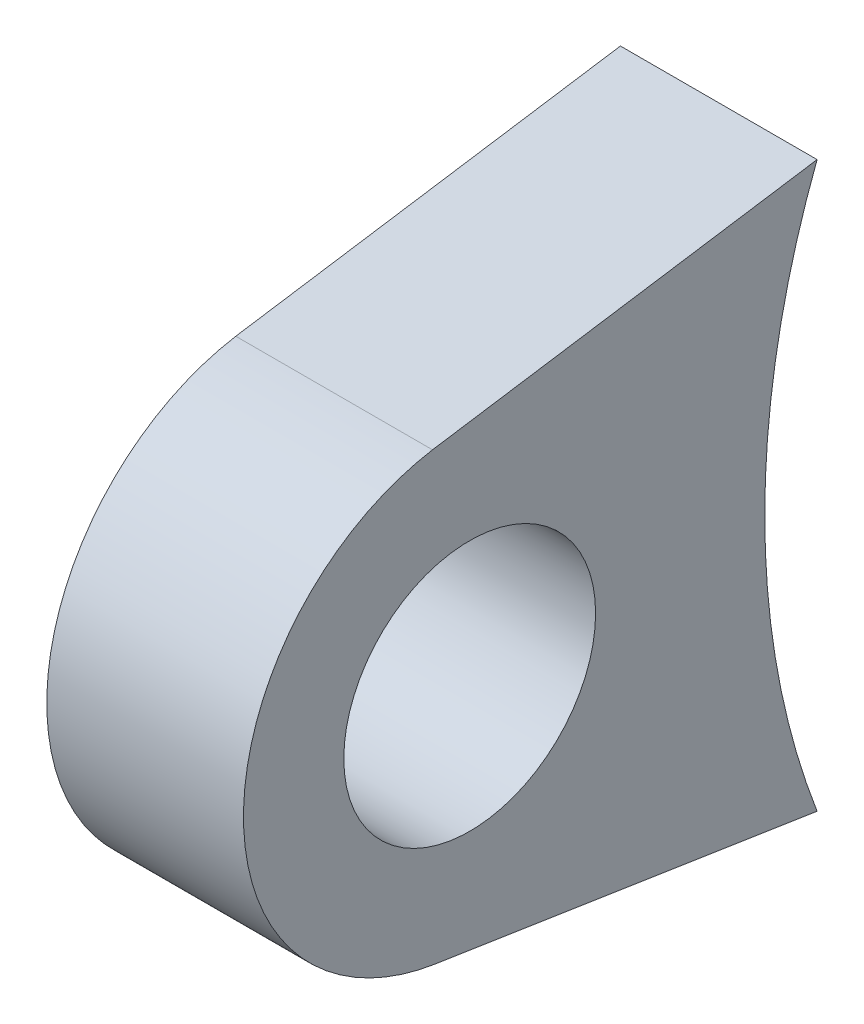
ISO-10303-21;
HEADER;
FILE_DESCRIPTION(('STEP AP214'),'2;1');
FILE_NAME('part.step','',(''),(''),'','','');
FILE_SCHEMA(('AUTOMOTIVE_DESIGN { 1 0 10303 214 1 1 1 1 }'));
ENDSEC;
DATA;
#1=APPLICATION_CONTEXT('core data for automotive mechanical design processes');
#2=APPLICATION_PROTOCOL_DEFINITION('international standard','automotive_design',2000,#1);
#3=PRODUCT_CONTEXT('',#1,'mechanical');
#4=PRODUCT('Part','Part','',(#3));
#5=PRODUCT_RELATED_PRODUCT_CATEGORY('part','',(#4));
#6=PRODUCT_DEFINITION_FORMATION('','',#4);
#7=PRODUCT_DEFINITION_CONTEXT('part definition',#1,'design');
#8=PRODUCT_DEFINITION('design','',#6,#7);
#9=PRODUCT_DEFINITION_SHAPE('','',#8);
#10=(LENGTH_UNIT() NAMED_UNIT(*) SI_UNIT(.MILLI.,.METRE.));
#11=(NAMED_UNIT(*) PLANE_ANGLE_UNIT() SI_UNIT($,.RADIAN.));
#12=(NAMED_UNIT(*) SI_UNIT($,.STERADIAN.) SOLID_ANGLE_UNIT());
#13=UNCERTAINTY_MEASURE_WITH_UNIT(LENGTH_MEASURE(1.E-05),#10,'distance_accuracy_value','');
#14=(GEOMETRIC_REPRESENTATION_CONTEXT(3) GLOBAL_UNCERTAINTY_ASSIGNED_CONTEXT((#13)) GLOBAL_UNIT_ASSIGNED_CONTEXT((#10,
#11,#12)) REPRESENTATION_CONTEXT('',''));
#15=CARTESIAN_POINT('',(0.,0.,0.));
#16=DIRECTION('',(0.,0.,1.));
#17=DIRECTION('',(1.,0.,0.));
#18=AXIS2_PLACEMENT_3D('',#15,#16,#17);
#19=CARTESIAN_POINT('',(86.7854475036722,9.80766511746572,1.50572599900162));
#20=DIRECTION('',(0.,-0.988419292284904,-0.15174749631875));
#21=DIRECTION('',(0.,0.15174749631875,-0.988419292284904));
#22=AXIS2_PLACEMENT_3D('',#19,#20,#21);
#23=PLANE('',#22);
#24=DIRECTION('',(0.,0.15174749631875,-0.988419292284904));
#25=VECTOR('',#24,1.);
#26=CARTESIAN_POINT('',(91.7854475036721,9.80766511746572,1.50572599900162));
#27=LINE('',#26,#25);
#28=CARTESIAN_POINT('',(91.7854475036721,5.67165495404934,28.4459545878146));
#29=VERTEX_POINT('',#28);
#30=CARTESIAN_POINT('',(91.7854475036721,7.17257303718955,18.6696062097244));
#31=VERTEX_POINT('',#30);
#32=EDGE_CURVE('E121',#29,#31,#27,.T.);
#33=ORIENTED_EDGE('',*,*,#32,.T.);
#34=DIRECTION('',(1.,0.,0.));
#35=VECTOR('',#34,1.);
#36=CARTESIAN_POINT('',(86.7854475036722,7.17257303718955,18.6696062097244));
#37=LINE('',#36,#35);
#38=CARTESIAN_POINT('',(86.7854475036722,7.17257303718955,18.6696062097244));
#39=VERTEX_POINT('',#38);
#40=EDGE_CURVE('E11',#39,#31,#37,.T.);
#41=ORIENTED_EDGE('',*,*,#40,.F.);
#42=DIRECTION('',(0.,0.15174749631875,-0.988419292284904));
#43=VECTOR('',#42,1.);
#44=CARTESIAN_POINT('',(86.7854475036722,9.80766511746572,1.50572599900162));
#45=LINE('',#44,#43);
#46=CARTESIAN_POINT('',(86.7854475036722,5.67165495404934,28.4459545878146));
#47=VERTEX_POINT('',#46);
#48=EDGE_CURVE('E109',#47,#39,#45,.T.);
#49=ORIENTED_EDGE('',*,*,#48,.F.);
#50=DIRECTION('',(1.,0.,0.));
#51=VECTOR('',#50,1.);
#52=CARTESIAN_POINT('',(86.7854475036722,5.67165495404934,28.4459545878146));
#53=LINE('',#52,#51);
#54=EDGE_CURVE('E48',#47,#29,#53,.T.);
#55=ORIENTED_EDGE('',*,*,#54,.T.);
#56=EDGE_LOOP('',(#33,#41,#49,#55));
#57=FACE_BOUND('',#56,.T.);
#58=ADVANCED_FACE('F45',(#57),#23,.F.);
#59=CARTESIAN_POINT('',(86.7854475036722,0.,0.));
#60=DIRECTION('',(1.,0.,0.));
#61=DIRECTION('',(0.,0.,-1.));
#62=AXIS2_PLACEMENT_3D('',#59,#60,#61);
#63=CYLINDRICAL_SURFACE('',#62,20.);
#64=CARTESIAN_POINT('',(91.7854475036721,0.,0.));
#65=DIRECTION('',(1.,0.,0.));
#66=DIRECTION('',(0.,0.,-1.));
#67=AXIS2_PLACEMENT_3D('',#64,#65,#66);
#68=CIRCLE('',#67,20.);
#69=CARTESIAN_POINT('',(91.7854475036721,-7.17257303718955,18.6696062097244));
#70=VERTEX_POINT('',#69);
#71=EDGE_CURVE('E77',#31,#70,#68,.T.);
#72=ORIENTED_EDGE('',*,*,#71,.T.);
#73=DIRECTION('',(1.,0.,0.));
#74=VECTOR('',#73,1.);
#75=CARTESIAN_POINT('',(86.7854475036722,-7.17257303718955,18.6696062097244));
#76=LINE('',#75,#74);
#77=CARTESIAN_POINT('',(86.7854475036722,-7.17257303718955,18.6696062097244));
#78=VERTEX_POINT('',#77);
#79=EDGE_CURVE('E55',#78,#70,#76,.T.);
#80=ORIENTED_EDGE('',*,*,#79,.F.);
#81=CARTESIAN_POINT('',(86.7854475036722,0.,0.));
#82=DIRECTION('',(1.,0.,0.));
#83=DIRECTION('',(0.,0.,-1.));
#84=AXIS2_PLACEMENT_3D('',#81,#82,#83);
#85=CIRCLE('',#84,20.);
#86=EDGE_CURVE('E63',#39,#78,#85,.T.);
#87=ORIENTED_EDGE('',*,*,#86,.F.);
#88=ORIENTED_EDGE('',*,*,#40,.T.);
#89=EDGE_LOOP('',(#72,#80,#87,#88));
#90=FACE_BOUND('',#89,.T.);
#91=ADVANCED_FACE('F141',(#90),#63,.F.);
#92=CARTESIAN_POINT('',(86.7854475036722,-9.80689850839444,1.50511687408894));
#93=DIRECTION('',(0.,0.988426720231568,-0.151699105904634));
#94=DIRECTION('',(0.,0.151699105904634,0.988426720231568));
#95=AXIS2_PLACEMENT_3D('',#92,#93,#94);
#96=PLANE('',#95);
#97=DIRECTION('',(0.,0.151699105904634,0.988426720231568));
#98=VECTOR('',#97,1.);
#99=CARTESIAN_POINT('',(91.7854475036721,-9.80689850839444,1.50511687408894));
#100=LINE('',#99,#98);
#101=CARTESIAN_POINT('',(91.7854475036721,-5.68345364133152,28.3722698589516));
#102=VERTEX_POINT('',#101);
#103=EDGE_CURVE('E104',#70,#102,#100,.T.);
#104=ORIENTED_EDGE('',*,*,#103,.T.);
#105=DIRECTION('',(1.,0.,0.));
#106=VECTOR('',#105,1.);
#107=CARTESIAN_POINT('',(86.7854475036722,-5.68345364133152,28.3722698589516));
#108=LINE('',#107,#106);
#109=CARTESIAN_POINT('',(86.7854475036722,-5.68345364133152,28.3722698589516));
#110=VERTEX_POINT('',#109);
#111=EDGE_CURVE('E102',#110,#102,#108,.T.);
#112=ORIENTED_EDGE('',*,*,#111,.F.);
#113=DIRECTION('',(0.,0.151699105904634,0.988426720231568));
#114=VECTOR('',#113,1.);
#115=CARTESIAN_POINT('',(86.7854475036722,-9.80689850839444,1.50511687408894));
#116=LINE('',#115,#114);
#117=EDGE_CURVE('E93',#78,#110,#116,.T.);
#118=ORIENTED_EDGE('',*,*,#117,.F.);
#119=ORIENTED_EDGE('',*,*,#79,.T.);
#120=EDGE_LOOP('',(#104,#112,#118,#119));
#121=FACE_BOUND('',#120,.T.);
#122=ADVANCED_FACE('F103',(#121),#96,.F.);
#123=CARTESIAN_POINT('',(86.7854475036722,0.,27.5));
#124=DIRECTION('',(1.,0.,0.));
#125=DIRECTION('',(0.,0.,-1.));
#126=AXIS2_PLACEMENT_3D('',#123,#124,#125);
#127=CYLINDRICAL_SURFACE('',#126,5.75);
#128=CARTESIAN_POINT('',(91.7854475036721,0.,27.5));
#129=DIRECTION('',(1.,0.,0.));
#130=DIRECTION('',(0.,0.,-1.));
#131=AXIS2_PLACEMENT_3D('',#128,#129,#130);
#132=CIRCLE('',#131,5.75);
#133=EDGE_CURVE('E125',#29,#102,#132,.T.);
#134=ORIENTED_EDGE('',*,*,#133,.F.);
#135=ORIENTED_EDGE('',*,*,#54,.F.);
#136=CARTESIAN_POINT('',(86.7854475036722,0.,27.5));
#137=DIRECTION('',(1.,0.,0.));
#138=DIRECTION('',(0.,0.,-1.));
#139=AXIS2_PLACEMENT_3D('',#136,#137,#138);
#140=CIRCLE('',#139,5.75);
#141=EDGE_CURVE('E97',#47,#110,#140,.T.);
#142=ORIENTED_EDGE('',*,*,#141,.T.);
#143=ORIENTED_EDGE('',*,*,#111,.T.);
#144=EDGE_LOOP('',(#134,#135,#142,#143));
#145=FACE_BOUND('',#144,.T.);
#146=ADVANCED_FACE('F107',(#145),#127,.T.);
#147=CARTESIAN_POINT('',(86.7854475036722,0.,27.5));
#148=DIRECTION('',(1.,0.,0.));
#149=DIRECTION('',(0.,0.,-1.));
#150=AXIS2_PLACEMENT_3D('',#147,#148,#149);
#151=CYLINDRICAL_SURFACE('',#150,3.2);
#152=CARTESIAN_POINT('',(86.7854475036722,0.,27.5));
#153=DIRECTION('',(1.,0.,0.));
#154=DIRECTION('',(0.,0.,-1.));
#155=AXIS2_PLACEMENT_3D('',#152,#153,#154);
#156=CIRCLE('',#155,3.2);
#157=CARTESIAN_POINT('',(86.7854475036722,0.,24.3));
#158=VERTEX_POINT('',#157);
#159=EDGE_CURVE('E117',#158,#158,#156,.T.);
#160=ORIENTED_EDGE('',*,*,#159,.F.);
#161=EDGE_LOOP('',(#160));
#162=FACE_BOUND('',#161,.T.);
#163=CARTESIAN_POINT('',(91.7854475036721,0.,27.5));
#164=DIRECTION('',(1.,0.,0.));
#165=DIRECTION('',(0.,0.,-1.));
#166=AXIS2_PLACEMENT_3D('',#163,#164,#165);
#167=CIRCLE('',#166,3.2);
#168=CARTESIAN_POINT('',(91.7854475036721,0.,24.3));
#169=VERTEX_POINT('',#168);
#170=EDGE_CURVE('E112',#169,#169,#167,.T.);
#171=ORIENTED_EDGE('',*,*,#170,.T.);
#172=EDGE_LOOP('',(#171));
#173=FACE_BOUND('',#172,.T.);
#174=ADVANCED_FACE('F150',(#162,#173),#151,.F.);
#175=CARTESIAN_POINT('',(86.7854475036722,0.,0.));
#176=DIRECTION('',(1.,0.,0.));
#177=DIRECTION('',(0.,0.,-1.));
#178=AXIS2_PLACEMENT_3D('',#175,#176,#177);
#179=PLANE('',#178);
#180=ORIENTED_EDGE('',*,*,#48,.T.);
#181=ORIENTED_EDGE('',*,*,#86,.T.);
#182=ORIENTED_EDGE('',*,*,#117,.T.);
#183=ORIENTED_EDGE('',*,*,#141,.F.);
#184=EDGE_LOOP('',(#180,#181,#182,#183));
#185=FACE_BOUND('',#184,.T.);
#186=ORIENTED_EDGE('',*,*,#159,.T.);
#187=EDGE_LOOP('',(#186));
#188=FACE_BOUND('',#187,.T.);
#189=ADVANCED_FACE('F95',(#185,#188),#179,.F.);
#190=CARTESIAN_POINT('',(91.7854475036721,0.,0.));
#191=DIRECTION('',(1.,0.,0.));
#192=DIRECTION('',(0.,0.,-1.));
#193=AXIS2_PLACEMENT_3D('',#190,#191,#192);
#194=PLANE('',#193);
#195=ORIENTED_EDGE('',*,*,#32,.F.);
#196=ORIENTED_EDGE('',*,*,#133,.T.);
#197=ORIENTED_EDGE('',*,*,#103,.F.);
#198=ORIENTED_EDGE('',*,*,#71,.F.);
#199=EDGE_LOOP('',(#195,#196,#197,#198));
#200=FACE_BOUND('',#199,.T.);
#201=ORIENTED_EDGE('',*,*,#170,.F.);
#202=EDGE_LOOP('',(#201));
#203=FACE_BOUND('',#202,.T.);
#204=ADVANCED_FACE('F136',(#200,#203),#194,.T.);
#205=CLOSED_SHELL('',(#58,#91,#122,#146,#174,#189,#204));
#206=MANIFOLD_SOLID_BREP('B2',#205);
#207=ADVANCED_BREP_SHAPE_REPRESENTATION('',(#18,#206),#14);
#208=SHAPE_DEFINITION_REPRESENTATION(#9,#207);
ENDSEC;
END-ISO-10303-21;
